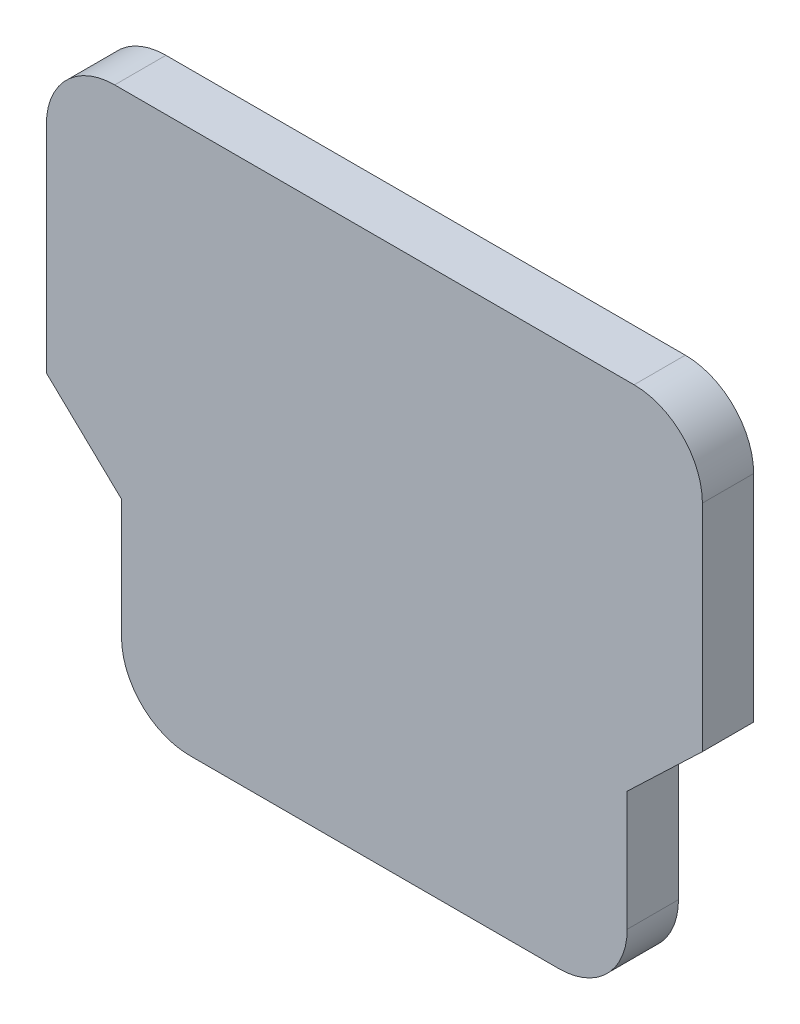
ISO-10303-21;
HEADER;
FILE_DESCRIPTION(('STEP AP214'),'2;1');
FILE_NAME('part.step','',(''),(''),'','','');
FILE_SCHEMA(('AUTOMOTIVE_DESIGN { 1 0 10303 214 1 1 1 1 }'));
ENDSEC;
DATA;
#1=APPLICATION_CONTEXT('core data for automotive mechanical design processes');
#2=APPLICATION_PROTOCOL_DEFINITION('international standard','automotive_design',2000,#1);
#3=PRODUCT_CONTEXT('',#1,'mechanical');
#4=PRODUCT('Part','Part','',(#3));
#5=PRODUCT_RELATED_PRODUCT_CATEGORY('part','',(#4));
#6=PRODUCT_DEFINITION_FORMATION('','',#4);
#7=PRODUCT_DEFINITION_CONTEXT('part definition',#1,'design');
#8=PRODUCT_DEFINITION('design','',#6,#7);
#9=PRODUCT_DEFINITION_SHAPE('','',#8);
#10=(LENGTH_UNIT() NAMED_UNIT(*) SI_UNIT(.MILLI.,.METRE.));
#11=(NAMED_UNIT(*) PLANE_ANGLE_UNIT() SI_UNIT($,.RADIAN.));
#12=(NAMED_UNIT(*) SI_UNIT($,.STERADIAN.) SOLID_ANGLE_UNIT());
#13=UNCERTAINTY_MEASURE_WITH_UNIT(LENGTH_MEASURE(1.E-05),#10,'distance_accuracy_value','');
#14=(GEOMETRIC_REPRESENTATION_CONTEXT(3) GLOBAL_UNCERTAINTY_ASSIGNED_CONTEXT((#13)) GLOBAL_UNIT_ASSIGNED_CONTEXT((#10,
#11,#12)) REPRESENTATION_CONTEXT('',''));
#15=CARTESIAN_POINT('',(0.,0.,0.));
#16=DIRECTION('',(0.,0.,1.));
#17=DIRECTION('',(1.,0.,0.));
#18=AXIS2_PLACEMENT_3D('',#15,#16,#17);
#19=CARTESIAN_POINT('',(-10.7053977272727,7.83707386363636,1.5));
#20=DIRECTION('',(1.,0.,0.));
#21=DIRECTION('',(0.,0.,-1.));
#22=AXIS2_PLACEMENT_3D('',#19,#20,#21);
#23=PLANE('',#22);
#24=DIRECTION('',(0.,-1.,0.));
#25=VECTOR('',#24,1.);
#26=CARTESIAN_POINT('',(-10.7053977272727,7.83707386363636,1.5));
#27=LINE('',#26,#25);
#28=CARTESIAN_POINT('',(-10.7053977272727,5.83707386363636,1.5));
#29=VERTEX_POINT('',#28);
#30=CARTESIAN_POINT('',(-10.7053977272727,-0.462926136363636,1.5));
#31=VERTEX_POINT('',#30);
#32=EDGE_CURVE('E119',#29,#31,#27,.T.);
#33=ORIENTED_EDGE('',*,*,#32,.F.);
#34=DIRECTION('',(0.,0.,-1.));
#35=VECTOR('',#34,1.);
#36=CARTESIAN_POINT('',(-10.7053977272727,5.83707386363636,1.5));
#37=LINE('',#36,#35);
#38=CARTESIAN_POINT('',(-10.7053977272727,5.83707386363636,0.));
#39=VERTEX_POINT('',#38);
#40=EDGE_CURVE('E173',#29,#39,#37,.T.);
#41=ORIENTED_EDGE('',*,*,#40,.T.);
#42=DIRECTION('',(0.,-1.,0.));
#43=VECTOR('',#42,1.);
#44=CARTESIAN_POINT('',(-10.7053977272727,7.83707386363636,0.));
#45=LINE('',#44,#43);
#46=CARTESIAN_POINT('',(-10.7053977272727,-0.462926136363636,0.));
#47=VERTEX_POINT('',#46);
#48=EDGE_CURVE('E145',#39,#47,#45,.T.);
#49=ORIENTED_EDGE('',*,*,#48,.T.);
#50=DIRECTION('',(0.,0.,-1.));
#51=VECTOR('',#50,1.);
#52=CARTESIAN_POINT('',(-10.7053977272727,-0.462926136363636,1.5));
#53=LINE('',#52,#51);
#54=EDGE_CURVE('E138',#31,#47,#53,.T.);
#55=ORIENTED_EDGE('',*,*,#54,.F.);
#56=EDGE_LOOP('',(#33,#41,#49,#55));
#57=FACE_BOUND('',#56,.T.);
#58=ADVANCED_FACE('F32',(#57),#23,.F.);
#59=CARTESIAN_POINT('',(-8.50539772727273,-2.56292613636364,1.5));
#60=DIRECTION('',(0.690475746682501,0.723355544143572,0.));
#61=DIRECTION('',(-0.723355544143572,0.690475746682501,0.));
#62=AXIS2_PLACEMENT_3D('',#59,#60,#61);
#63=PLANE('',#62);
#64=DIRECTION('',(0.723355544143572,-0.690475746682501,0.));
#65=VECTOR('',#64,1.);
#66=CARTESIAN_POINT('',(-8.50539772727273,-2.56292613636364,0.));
#67=LINE('',#66,#65);
#68=CARTESIAN_POINT('',(-8.50539772727273,-2.56292613636364,0.));
#69=VERTEX_POINT('',#68);
#70=EDGE_CURVE('E198',#47,#69,#67,.T.);
#71=ORIENTED_EDGE('',*,*,#70,.T.);
#72=DIRECTION('',(0.,0.,-1.));
#73=VECTOR('',#72,1.);
#74=CARTESIAN_POINT('',(-8.50539772727273,-2.56292613636364,1.5));
#75=LINE('',#74,#73);
#76=CARTESIAN_POINT('',(-8.50539772727273,-2.56292613636364,1.5));
#77=VERTEX_POINT('',#76);
#78=EDGE_CURVE('E140',#77,#69,#75,.T.);
#79=ORIENTED_EDGE('',*,*,#78,.F.);
#80=DIRECTION('',(0.723355544143572,-0.690475746682501,0.));
#81=VECTOR('',#80,1.);
#82=CARTESIAN_POINT('',(-8.50539772727273,-2.56292613636364,1.5));
#83=LINE('',#82,#81);
#84=EDGE_CURVE('E124',#31,#77,#83,.T.);
#85=ORIENTED_EDGE('',*,*,#84,.F.);
#86=ORIENTED_EDGE('',*,*,#54,.T.);
#87=EDGE_LOOP('',(#71,#79,#85,#86));
#88=FACE_BOUND('',#87,.T.);
#89=ADVANCED_FACE('F137',(#88),#63,.F.);
#90=CARTESIAN_POINT('',(-8.50539772727273,-8.06292613636364,1.5));
#91=DIRECTION('',(1.,0.,0.));
#92=DIRECTION('',(0.,0.,-1.));
#93=AXIS2_PLACEMENT_3D('',#90,#91,#92);
#94=PLANE('',#93);
#95=DIRECTION('',(0.,-1.,0.));
#96=VECTOR('',#95,1.);
#97=CARTESIAN_POINT('',(-8.50539772727273,-8.06292613636364,0.));
#98=LINE('',#97,#96);
#99=CARTESIAN_POINT('',(-8.50539772727273,-6.06292613636364,0.));
#100=VERTEX_POINT('',#99);
#101=EDGE_CURVE('E194',#69,#100,#98,.T.);
#102=ORIENTED_EDGE('',*,*,#101,.T.);
#103=DIRECTION('',(0.,0.,-1.));
#104=VECTOR('',#103,1.);
#105=CARTESIAN_POINT('',(-8.50539772727273,-6.06292613636364,1.5));
#106=LINE('',#105,#104);
#107=CARTESIAN_POINT('',(-8.50539772727273,-6.06292613636364,1.5));
#108=VERTEX_POINT('',#107);
#109=EDGE_CURVE('E11',#100,#108,#106,.F.);
#110=ORIENTED_EDGE('',*,*,#109,.T.);
#111=DIRECTION('',(0.,-1.,0.));
#112=VECTOR('',#111,1.);
#113=CARTESIAN_POINT('',(-8.50539772727273,-8.06292613636364,1.5));
#114=LINE('',#113,#112);
#115=EDGE_CURVE('E142',#77,#108,#114,.T.);
#116=ORIENTED_EDGE('',*,*,#115,.F.);
#117=ORIENTED_EDGE('',*,*,#78,.T.);
#118=EDGE_LOOP('',(#102,#110,#116,#117));
#119=FACE_BOUND('',#118,.T.);
#120=ADVANCED_FACE('F239',(#119),#94,.F.);
#121=CARTESIAN_POINT('',(-8.50539772727273,-8.06292613636364,1.5));
#122=DIRECTION('',(0.,1.,0.));
#123=DIRECTION('',(0.,0.,1.));
#124=AXIS2_PLACEMENT_3D('',#121,#122,#123);
#125=PLANE('',#124);
#126=DIRECTION('',(1.,0.,0.));
#127=VECTOR('',#126,1.);
#128=CARTESIAN_POINT('',(-8.50539772727273,-8.06292613636364,0.));
#129=LINE('',#128,#127);
#130=CARTESIAN_POINT('',(-6.50539772727273,-8.06292613636364,0.));
#131=VERTEX_POINT('',#130);
#132=CARTESIAN_POINT('',(4.29460227272727,-8.06292613636364,0.));
#133=VERTEX_POINT('',#132);
#134=EDGE_CURVE('E183',#131,#133,#129,.T.);
#135=ORIENTED_EDGE('',*,*,#134,.T.);
#136=DIRECTION('',(0.,0.,-1.));
#137=VECTOR('',#136,1.);
#138=CARTESIAN_POINT('',(4.29460227272727,-8.06292613636364,1.5));
#139=LINE('',#138,#137);
#140=CARTESIAN_POINT('',(4.29460227272727,-8.06292613636364,1.5));
#141=VERTEX_POINT('',#140);
#142=EDGE_CURVE('E40',#133,#141,#139,.F.);
#143=ORIENTED_EDGE('',*,*,#142,.T.);
#144=DIRECTION('',(1.,0.,0.));
#145=VECTOR('',#144,1.);
#146=CARTESIAN_POINT('',(-8.50539772727273,-8.06292613636364,1.5));
#147=LINE('',#146,#145);
#148=CARTESIAN_POINT('',(-6.50539772727273,-8.06292613636364,1.5));
#149=VERTEX_POINT('',#148);
#150=EDGE_CURVE('E184',#149,#141,#147,.T.);
#151=ORIENTED_EDGE('',*,*,#150,.F.);
#152=DIRECTION('',(0.,0.,-1.));
#153=VECTOR('',#152,1.);
#154=CARTESIAN_POINT('',(-6.50539772727273,-8.06292613636364,1.5));
#155=LINE('',#154,#153);
#156=EDGE_CURVE('E178',#149,#131,#155,.T.);
#157=ORIENTED_EDGE('',*,*,#156,.T.);
#158=EDGE_LOOP('',(#135,#143,#151,#157));
#159=FACE_BOUND('',#158,.T.);
#160=ADVANCED_FACE('F182',(#159),#125,.F.);
#161=CARTESIAN_POINT('',(6.29460227272727,-8.06292613636364,1.5));
#162=DIRECTION('',(-1.,0.,0.));
#163=DIRECTION('',(0.,0.,1.));
#164=AXIS2_PLACEMENT_3D('',#161,#162,#163);
#165=PLANE('',#164);
#166=DIRECTION('',(0.,1.,0.));
#167=VECTOR('',#166,1.);
#168=CARTESIAN_POINT('',(6.29460227272727,-8.06292613636364,1.5));
#169=LINE('',#168,#167);
#170=CARTESIAN_POINT('',(6.29460227272727,-6.06292613636364,1.5));
#171=VERTEX_POINT('',#170);
#172=CARTESIAN_POINT('',(6.29460227272727,-2.56292613636364,1.5));
#173=VERTEX_POINT('',#172);
#174=EDGE_CURVE('E242',#171,#173,#169,.T.);
#175=ORIENTED_EDGE('',*,*,#174,.F.);
#176=DIRECTION('',(0.,0.,-1.));
#177=VECTOR('',#176,1.);
#178=CARTESIAN_POINT('',(6.29460227272727,-6.06292613636364,1.5));
#179=LINE('',#178,#177);
#180=CARTESIAN_POINT('',(6.29460227272727,-6.06292613636364,0.));
#181=VERTEX_POINT('',#180);
#182=EDGE_CURVE('E175',#171,#181,#179,.T.);
#183=ORIENTED_EDGE('',*,*,#182,.T.);
#184=DIRECTION('',(0.,1.,0.));
#185=VECTOR('',#184,1.);
#186=CARTESIAN_POINT('',(6.29460227272727,-8.06292613636364,0.));
#187=LINE('',#186,#185);
#188=CARTESIAN_POINT('',(6.29460227272727,-2.56292613636364,0.));
#189=VERTEX_POINT('',#188);
#190=EDGE_CURVE('E193',#181,#189,#187,.T.);
#191=ORIENTED_EDGE('',*,*,#190,.T.);
#192=DIRECTION('',(0.,0.,-1.));
#193=VECTOR('',#192,1.);
#194=CARTESIAN_POINT('',(6.29460227272727,-2.56292613636364,1.5));
#195=LINE('',#194,#193);
#196=EDGE_CURVE('E151',#173,#189,#195,.T.);
#197=ORIENTED_EDGE('',*,*,#196,.F.);
#198=EDGE_LOOP('',(#175,#183,#191,#197));
#199=FACE_BOUND('',#198,.T.);
#200=ADVANCED_FACE('F246',(#199),#165,.F.);
#201=CARTESIAN_POINT('',(6.29460227272727,-2.56292613636364,1.5));
#202=DIRECTION('',(-0.690475746682501,0.723355544143572,0.));
#203=DIRECTION('',(-0.723355544143572,-0.690475746682501,0.));
#204=AXIS2_PLACEMENT_3D('',#201,#202,#203);
#205=PLANE('',#204);
#206=DIRECTION('',(0.723355544143572,0.690475746682501,0.));
#207=VECTOR('',#206,1.);
#208=CARTESIAN_POINT('',(6.29460227272727,-2.56292613636364,0.));
#209=LINE('',#208,#207);
#210=CARTESIAN_POINT('',(8.49460227272728,-0.462926136363636,0.));
#211=VERTEX_POINT('',#210);
#212=EDGE_CURVE('E196',#189,#211,#209,.T.);
#213=ORIENTED_EDGE('',*,*,#212,.T.);
#214=DIRECTION('',(0.,0.,-1.));
#215=VECTOR('',#214,1.);
#216=CARTESIAN_POINT('',(8.49460227272728,-0.462926136363636,1.5));
#217=LINE('',#216,#215);
#218=CARTESIAN_POINT('',(8.49460227272728,-0.462926136363636,1.5));
#219=VERTEX_POINT('',#218);
#220=EDGE_CURVE('E208',#219,#211,#217,.T.);
#221=ORIENTED_EDGE('',*,*,#220,.F.);
#222=DIRECTION('',(0.723355544143572,0.690475746682501,0.));
#223=VECTOR('',#222,1.);
#224=CARTESIAN_POINT('',(6.29460227272727,-2.56292613636364,1.5));
#225=LINE('',#224,#223);
#226=EDGE_CURVE('E218',#173,#219,#225,.T.);
#227=ORIENTED_EDGE('',*,*,#226,.F.);
#228=ORIENTED_EDGE('',*,*,#196,.T.);
#229=EDGE_LOOP('',(#213,#221,#227,#228));
#230=FACE_BOUND('',#229,.T.);
#231=ADVANCED_FACE('F216',(#230),#205,.F.);
#232=CARTESIAN_POINT('',(8.49460227272727,7.83707386363636,1.5));
#233=DIRECTION('',(-1.,0.,0.));
#234=DIRECTION('',(0.,-1.,0.));
#235=AXIS2_PLACEMENT_3D('',#232,#233,#234);
#236=PLANE('',#235);
#237=DIRECTION('',(0.,1.,0.));
#238=VECTOR('',#237,1.);
#239=CARTESIAN_POINT('',(8.49460227272727,7.83707386363636,0.));
#240=LINE('',#239,#238);
#241=CARTESIAN_POINT('',(8.49460227272727,5.83707386363636,0.));
#242=VERTEX_POINT('',#241);
#243=EDGE_CURVE('E203',#211,#242,#240,.T.);
#244=ORIENTED_EDGE('',*,*,#243,.T.);
#245=DIRECTION('',(0.,0.,-1.));
#246=VECTOR('',#245,1.);
#247=CARTESIAN_POINT('',(8.49460227272727,5.83707386363636,1.5));
#248=LINE('',#247,#246);
#249=CARTESIAN_POINT('',(8.49460227272727,5.83707386363636,1.5));
#250=VERTEX_POINT('',#249);
#251=EDGE_CURVE('E165',#242,#250,#248,.F.);
#252=ORIENTED_EDGE('',*,*,#251,.T.);
#253=DIRECTION('',(0.,1.,0.));
#254=VECTOR('',#253,1.);
#255=CARTESIAN_POINT('',(8.49460227272727,7.83707386363636,1.5));
#256=LINE('',#255,#254);
#257=EDGE_CURVE('E230',#219,#250,#256,.T.);
#258=ORIENTED_EDGE('',*,*,#257,.F.);
#259=ORIENTED_EDGE('',*,*,#220,.T.);
#260=EDGE_LOOP('',(#244,#252,#258,#259));
#261=FACE_BOUND('',#260,.T.);
#262=ADVANCED_FACE('F223',(#261),#236,.F.);
#263=CARTESIAN_POINT('',(-10.7053977272727,7.83707386363636,1.5));
#264=DIRECTION('',(0.,-1.,0.));
#265=DIRECTION('',(0.,0.,-1.));
#266=AXIS2_PLACEMENT_3D('',#263,#264,#265);
#267=PLANE('',#266);
#268=DIRECTION('',(-1.,0.,0.));
#269=VECTOR('',#268,1.);
#270=CARTESIAN_POINT('',(-10.7053977272727,7.83707386363636,1.5));
#271=LINE('',#270,#269);
#272=CARTESIAN_POINT('',(6.49460227272727,7.83707386363636,1.5));
#273=VERTEX_POINT('',#272);
#274=CARTESIAN_POINT('',(-8.70539772727273,7.83707386363636,1.5));
#275=VERTEX_POINT('',#274);
#276=EDGE_CURVE('E210',#273,#275,#271,.T.);
#277=ORIENTED_EDGE('',*,*,#276,.F.);
#278=DIRECTION('',(0.,0.,-1.));
#279=VECTOR('',#278,1.);
#280=CARTESIAN_POINT('',(6.49460227272727,7.83707386363636,1.5));
#281=LINE('',#280,#279);
#282=CARTESIAN_POINT('',(6.49460227272727,7.83707386363636,0.));
#283=VERTEX_POINT('',#282);
#284=EDGE_CURVE('E149',#273,#283,#281,.T.);
#285=ORIENTED_EDGE('',*,*,#284,.T.);
#286=DIRECTION('',(-1.,0.,0.));
#287=VECTOR('',#286,1.);
#288=CARTESIAN_POINT('',(-10.7053977272727,7.83707386363636,0.));
#289=LINE('',#288,#287);
#290=CARTESIAN_POINT('',(-8.70539772727273,7.83707386363636,0.));
#291=VERTEX_POINT('',#290);
#292=EDGE_CURVE('E133',#283,#291,#289,.T.);
#293=ORIENTED_EDGE('',*,*,#292,.T.);
#294=DIRECTION('',(0.,0.,-1.));
#295=VECTOR('',#294,1.);
#296=CARTESIAN_POINT('',(-8.70539772727273,7.83707386363636,1.5));
#297=LINE('',#296,#295);
#298=EDGE_CURVE('E147',#291,#275,#297,.F.);
#299=ORIENTED_EDGE('',*,*,#298,.T.);
#300=EDGE_LOOP('',(#277,#285,#293,#299));
#301=FACE_BOUND('',#300,.T.);
#302=ADVANCED_FACE('F232',(#301),#267,.F.);
#303=CARTESIAN_POINT('',(0.,0.,1.5));
#304=DIRECTION('',(0.,0.,1.));
#305=DIRECTION('',(1.,0.,0.));
#306=AXIS2_PLACEMENT_3D('',#303,#304,#305);
#307=PLANE('',#306);
#308=ORIENTED_EDGE('',*,*,#257,.T.);
#309=CARTESIAN_POINT('',(6.49460227272727,5.83707386363636,1.5));
#310=DIRECTION('',(0.,0.,1.));
#311=DIRECTION('',(1.,0.,0.));
#312=AXIS2_PLACEMENT_3D('',#309,#310,#311);
#313=CIRCLE('',#312,2.);
#314=EDGE_CURVE('E171',#250,#273,#313,.T.);
#315=ORIENTED_EDGE('',*,*,#314,.T.);
#316=ORIENTED_EDGE('',*,*,#276,.T.);
#317=CARTESIAN_POINT('',(-8.70539772727273,5.83707386363636,1.5));
#318=DIRECTION('',(0.,0.,1.));
#319=DIRECTION('',(1.,0.,0.));
#320=AXIS2_PLACEMENT_3D('',#317,#318,#319);
#321=CIRCLE('',#320,2.);
#322=EDGE_CURVE('E128',#275,#29,#321,.T.);
#323=ORIENTED_EDGE('',*,*,#322,.T.);
#324=ORIENTED_EDGE('',*,*,#32,.T.);
#325=ORIENTED_EDGE('',*,*,#84,.T.);
#326=ORIENTED_EDGE('',*,*,#115,.T.);
#327=CARTESIAN_POINT('',(-6.50539772727273,-6.06292613636364,1.5));
#328=DIRECTION('',(0.,0.,1.));
#329=DIRECTION('',(1.,0.,0.));
#330=AXIS2_PLACEMENT_3D('',#327,#328,#329);
#331=CIRCLE('',#330,2.);
#332=EDGE_CURVE('E167',#108,#149,#331,.T.);
#333=ORIENTED_EDGE('',*,*,#332,.T.);
#334=ORIENTED_EDGE('',*,*,#150,.T.);
#335=CARTESIAN_POINT('',(4.29460227272727,-6.06292613636364,1.5));
#336=DIRECTION('',(0.,0.,1.));
#337=DIRECTION('',(1.,0.,0.));
#338=AXIS2_PLACEMENT_3D('',#335,#336,#337);
#339=CIRCLE('',#338,2.);
#340=EDGE_CURVE('E47',#141,#171,#339,.T.);
#341=ORIENTED_EDGE('',*,*,#340,.T.);
#342=ORIENTED_EDGE('',*,*,#174,.T.);
#343=ORIENTED_EDGE('',*,*,#226,.T.);
#344=EDGE_LOOP('',(#308,#315,#316,#323,#324,#325,#326,#333,#334,#341,#342,#343));
#345=FACE_BOUND('',#344,.T.);
#346=ADVANCED_FACE('F122',(#345),#307,.T.);
#347=CARTESIAN_POINT('',(0.,0.,0.));
#348=DIRECTION('',(0.,0.,1.));
#349=DIRECTION('',(1.,0.,0.));
#350=AXIS2_PLACEMENT_3D('',#347,#348,#349);
#351=PLANE('',#350);
#352=ORIENTED_EDGE('',*,*,#292,.F.);
#353=CARTESIAN_POINT('',(6.49460227272727,5.83707386363636,0.));
#354=DIRECTION('',(0.,0.,1.));
#355=DIRECTION('',(1.,0.,0.));
#356=AXIS2_PLACEMENT_3D('',#353,#354,#355);
#357=CIRCLE('',#356,2.);
#358=EDGE_CURVE('E163',#283,#242,#357,.F.);
#359=ORIENTED_EDGE('',*,*,#358,.T.);
#360=ORIENTED_EDGE('',*,*,#243,.F.);
#361=ORIENTED_EDGE('',*,*,#212,.F.);
#362=ORIENTED_EDGE('',*,*,#190,.F.);
#363=CARTESIAN_POINT('',(4.29460227272727,-6.06292613636364,0.));
#364=DIRECTION('',(0.,0.,1.));
#365=DIRECTION('',(1.,0.,0.));
#366=AXIS2_PLACEMENT_3D('',#363,#364,#365);
#367=CIRCLE('',#366,2.);
#368=EDGE_CURVE('E159',#181,#133,#367,.F.);
#369=ORIENTED_EDGE('',*,*,#368,.T.);
#370=ORIENTED_EDGE('',*,*,#134,.F.);
#371=CARTESIAN_POINT('',(-6.50539772727273,-6.06292613636364,0.));
#372=DIRECTION('',(0.,0.,1.));
#373=DIRECTION('',(1.,0.,0.));
#374=AXIS2_PLACEMENT_3D('',#371,#372,#373);
#375=CIRCLE('',#374,2.);
#376=EDGE_CURVE('E157',#131,#100,#375,.F.);
#377=ORIENTED_EDGE('',*,*,#376,.T.);
#378=ORIENTED_EDGE('',*,*,#101,.F.);
#379=ORIENTED_EDGE('',*,*,#70,.F.);
#380=ORIENTED_EDGE('',*,*,#48,.F.);
#381=CARTESIAN_POINT('',(-8.70539772727273,5.83707386363636,0.));
#382=DIRECTION('',(0.,0.,1.));
#383=DIRECTION('',(1.,0.,0.));
#384=AXIS2_PLACEMENT_3D('',#381,#382,#383);
#385=CIRCLE('',#384,2.);
#386=EDGE_CURVE('E161',#39,#291,#385,.F.);
#387=ORIENTED_EDGE('',*,*,#386,.T.);
#388=EDGE_LOOP('',(#352,#359,#360,#361,#362,#369,#370,#377,#378,#379,#380,#387));
#389=FACE_BOUND('',#388,.T.);
#390=ADVANCED_FACE('F189',(#389),#351,.F.);
#391=CARTESIAN_POINT('',(6.49460227272727,5.83707386363636,1.5));
#392=DIRECTION('',(0.,0.,-1.));
#393=DIRECTION('',(-1.,0.,0.));
#394=AXIS2_PLACEMENT_3D('',#391,#392,#393);
#395=CYLINDRICAL_SURFACE('',#394,2.);
#396=ORIENTED_EDGE('',*,*,#314,.F.);
#397=ORIENTED_EDGE('',*,*,#251,.F.);
#398=ORIENTED_EDGE('',*,*,#358,.F.);
#399=ORIENTED_EDGE('',*,*,#284,.F.);
#400=EDGE_LOOP('',(#396,#397,#398,#399));
#401=FACE_BOUND('',#400,.T.);
#402=ADVANCED_FACE('F227',(#401),#395,.T.);
#403=CARTESIAN_POINT('',(-8.70539772727273,5.83707386363636,1.5));
#404=DIRECTION('',(0.,0.,-1.));
#405=DIRECTION('',(-1.,0.,0.));
#406=AXIS2_PLACEMENT_3D('',#403,#404,#405);
#407=CYLINDRICAL_SURFACE('',#406,2.);
#408=ORIENTED_EDGE('',*,*,#322,.F.);
#409=ORIENTED_EDGE('',*,*,#298,.F.);
#410=ORIENTED_EDGE('',*,*,#386,.F.);
#411=ORIENTED_EDGE('',*,*,#40,.F.);
#412=EDGE_LOOP('',(#408,#409,#410,#411));
#413=FACE_BOUND('',#412,.T.);
#414=ADVANCED_FACE('F250',(#413),#407,.T.);
#415=CARTESIAN_POINT('',(4.29460227272727,-6.06292613636364,1.5));
#416=DIRECTION('',(0.,0.,-1.));
#417=DIRECTION('',(-1.,0.,0.));
#418=AXIS2_PLACEMENT_3D('',#415,#416,#417);
#419=CYLINDRICAL_SURFACE('',#418,2.);
#420=ORIENTED_EDGE('',*,*,#340,.F.);
#421=ORIENTED_EDGE('',*,*,#142,.F.);
#422=ORIENTED_EDGE('',*,*,#368,.F.);
#423=ORIENTED_EDGE('',*,*,#182,.F.);
#424=EDGE_LOOP('',(#420,#421,#422,#423));
#425=FACE_BOUND('',#424,.T.);
#426=ADVANCED_FACE('F248',(#425),#419,.T.);
#427=CARTESIAN_POINT('',(-6.50539772727273,-6.06292613636364,1.5));
#428=DIRECTION('',(0.,0.,-1.));
#429=DIRECTION('',(-1.,0.,0.));
#430=AXIS2_PLACEMENT_3D('',#427,#428,#429);
#431=CYLINDRICAL_SURFACE('',#430,2.);
#432=ORIENTED_EDGE('',*,*,#332,.F.);
#433=ORIENTED_EDGE('',*,*,#109,.F.);
#434=ORIENTED_EDGE('',*,*,#376,.F.);
#435=ORIENTED_EDGE('',*,*,#156,.F.);
#436=EDGE_LOOP('',(#432,#433,#434,#435));
#437=FACE_BOUND('',#436,.T.);
#438=ADVANCED_FACE('F34',(#437),#431,.T.);
#439=CLOSED_SHELL('',(#58,#89,#120,#160,#200,#231,#262,#302,#346,#390,#402,#414,#426,#438));
#440=MANIFOLD_SOLID_BREP('B2',#439);
#441=ADVANCED_BREP_SHAPE_REPRESENTATION('',(#18,#440),#14);
#442=SHAPE_DEFINITION_REPRESENTATION(#9,#441);
ENDSEC;
END-ISO-10303-21;
